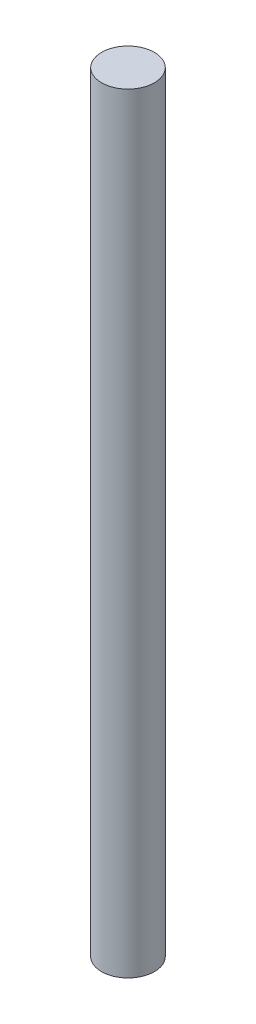
ISO-10303-21;
HEADER;
FILE_DESCRIPTION(('STEP AP214'),'2;1');
FILE_NAME('part.step','',(''),(''),'','','');
FILE_SCHEMA(('AUTOMOTIVE_DESIGN { 1 0 10303 214 1 1 1 1 }'));
ENDSEC;
DATA;
#1=APPLICATION_CONTEXT('core data for automotive mechanical design processes');
#2=APPLICATION_PROTOCOL_DEFINITION('international standard','automotive_design',2000,#1);
#3=PRODUCT_CONTEXT('',#1,'mechanical');
#4=PRODUCT('Part','Part','',(#3));
#5=PRODUCT_RELATED_PRODUCT_CATEGORY('part','',(#4));
#6=PRODUCT_DEFINITION_FORMATION('','',#4);
#7=PRODUCT_DEFINITION_CONTEXT('part definition',#1,'design');
#8=PRODUCT_DEFINITION('design','',#6,#7);
#9=PRODUCT_DEFINITION_SHAPE('','',#8);
#10=(LENGTH_UNIT() NAMED_UNIT(*) SI_UNIT(.MILLI.,.METRE.));
#11=(NAMED_UNIT(*) PLANE_ANGLE_UNIT() SI_UNIT($,.RADIAN.));
#12=(NAMED_UNIT(*) SI_UNIT($,.STERADIAN.) SOLID_ANGLE_UNIT());
#13=UNCERTAINTY_MEASURE_WITH_UNIT(LENGTH_MEASURE(1.E-05),#10,'distance_accuracy_value','');
#14=(GEOMETRIC_REPRESENTATION_CONTEXT(3) GLOBAL_UNCERTAINTY_ASSIGNED_CONTEXT((#13)) GLOBAL_UNIT_ASSIGNED_CONTEXT((#10,
#11,#12)) REPRESENTATION_CONTEXT('',''));
#15=CARTESIAN_POINT('',(0.,0.,0.));
#16=DIRECTION('',(0.,0.,1.));
#17=DIRECTION('',(1.,0.,0.));
#18=AXIS2_PLACEMENT_3D('',#15,#16,#17);
#19=CARTESIAN_POINT('',(0.,87.5,0.));
#20=DIRECTION('',(0.,-1.,0.));
#21=DIRECTION('',(0.,0.,-1.));
#22=AXIS2_PLACEMENT_3D('',#19,#20,#21);
#23=CYLINDRICAL_SURFACE('',#22,6.);
#24=CARTESIAN_POINT('',(0.,87.5,0.));
#25=DIRECTION('',(0.,1.,0.));
#26=DIRECTION('',(0.,0.,1.));
#27=AXIS2_PLACEMENT_3D('',#24,#25,#26);
#28=CIRCLE('',#27,6.);
#29=CARTESIAN_POINT('',(0.,87.5,6.));
#30=VERTEX_POINT('',#29);
#31=EDGE_CURVE('E10',#30,#30,#28,.T.);
#32=ORIENTED_EDGE('',*,*,#31,.F.);
#33=EDGE_LOOP('',(#32));
#34=FACE_BOUND('',#33,.T.);
#35=CARTESIAN_POINT('',(0.,-87.5,0.));
#36=DIRECTION('',(0.,1.,0.));
#37=DIRECTION('',(0.,0.,1.));
#38=AXIS2_PLACEMENT_3D('',#35,#36,#37);
#39=CIRCLE('',#38,6.);
#40=CARTESIAN_POINT('',(0.,-87.5,6.));
#41=VERTEX_POINT('',#40);
#42=EDGE_CURVE('E34',#41,#41,#39,.T.);
#43=ORIENTED_EDGE('',*,*,#42,.T.);
#44=EDGE_LOOP('',(#43));
#45=FACE_BOUND('',#44,.T.);
#46=ADVANCED_FACE('F31',(#34,#45),#23,.T.);
#47=CARTESIAN_POINT('',(0.,87.5,0.));
#48=DIRECTION('',(0.,1.,0.));
#49=DIRECTION('',(0.,0.,1.));
#50=AXIS2_PLACEMENT_3D('',#47,#48,#49);
#51=PLANE('',#50);
#52=ORIENTED_EDGE('',*,*,#31,.T.);
#53=EDGE_LOOP('',(#52));
#54=FACE_BOUND('',#53,.T.);
#55=ADVANCED_FACE('F46',(#54),#51,.T.);
#56=CARTESIAN_POINT('',(0.,-87.5,0.));
#57=DIRECTION('',(0.,1.,0.));
#58=DIRECTION('',(0.,0.,1.));
#59=AXIS2_PLACEMENT_3D('',#56,#57,#58);
#60=PLANE('',#59);
#61=ORIENTED_EDGE('',*,*,#42,.F.);
#62=EDGE_LOOP('',(#61));
#63=FACE_BOUND('',#62,.T.);
#64=ADVANCED_FACE('F44',(#63),#60,.F.);
#65=CLOSED_SHELL('',(#46,#55,#64));
#66=MANIFOLD_SOLID_BREP('B2',#65);
#67=ADVANCED_BREP_SHAPE_REPRESENTATION('',(#18,#66),#14);
#68=SHAPE_DEFINITION_REPRESENTATION(#9,#67);
ENDSEC;
END-ISO-10303-21;
